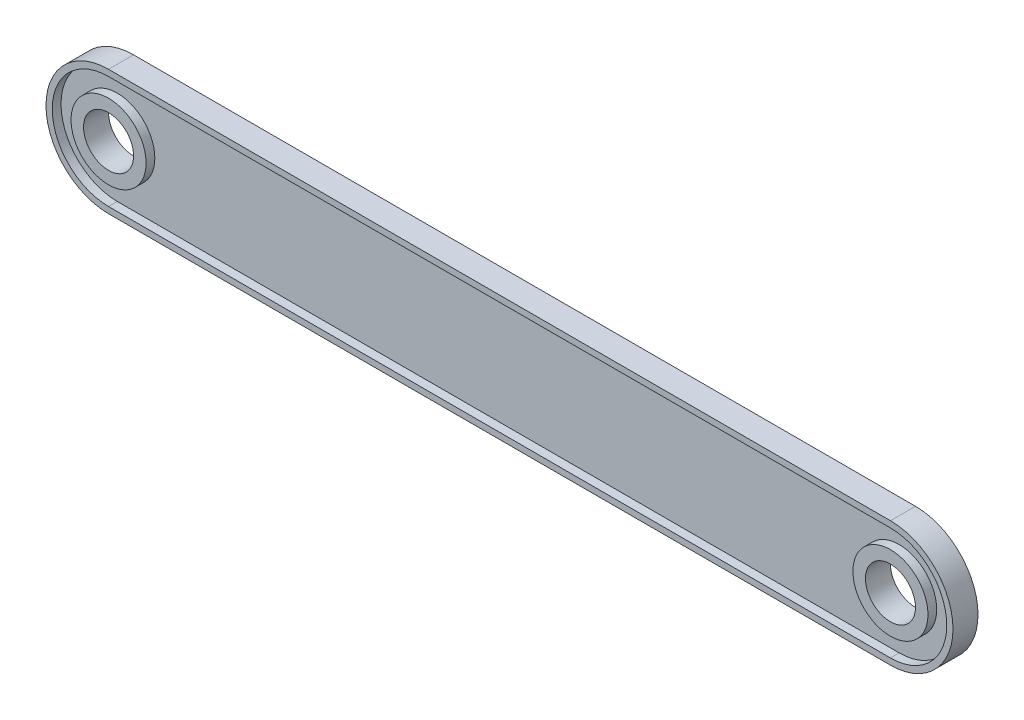
ISO-10303-21;
HEADER;
FILE_DESCRIPTION(('STEP AP214'),'2;1');
FILE_NAME('part.step','',(''),(''),'','','');
FILE_SCHEMA(('AUTOMOTIVE_DESIGN { 1 0 10303 214 1 1 1 1 }'));
ENDSEC;
DATA;
#1=APPLICATION_CONTEXT('core data for automotive mechanical design processes');
#2=APPLICATION_PROTOCOL_DEFINITION('international standard','automotive_design',2000,#1);
#3=PRODUCT_CONTEXT('',#1,'mechanical');
#4=PRODUCT('Part','Part','',(#3));
#5=PRODUCT_RELATED_PRODUCT_CATEGORY('part','',(#4));
#6=PRODUCT_DEFINITION_FORMATION('','',#4);
#7=PRODUCT_DEFINITION_CONTEXT('part definition',#1,'design');
#8=PRODUCT_DEFINITION('design','',#6,#7);
#9=PRODUCT_DEFINITION_SHAPE('','',#8);
#10=(LENGTH_UNIT() NAMED_UNIT(*) SI_UNIT(.MILLI.,.METRE.));
#11=(NAMED_UNIT(*) PLANE_ANGLE_UNIT() SI_UNIT($,.RADIAN.));
#12=(NAMED_UNIT(*) SI_UNIT($,.STERADIAN.) SOLID_ANGLE_UNIT());
#13=UNCERTAINTY_MEASURE_WITH_UNIT(LENGTH_MEASURE(1.E-05),#10,'distance_accuracy_value','');
#14=(GEOMETRIC_REPRESENTATION_CONTEXT(3) GLOBAL_UNCERTAINTY_ASSIGNED_CONTEXT((#13)) GLOBAL_UNIT_ASSIGNED_CONTEXT((#10,
#11,#12)) REPRESENTATION_CONTEXT('',''));
#15=CARTESIAN_POINT('',(0.,0.,0.));
#16=DIRECTION('',(0.,0.,1.));
#17=DIRECTION('',(1.,0.,0.));
#18=AXIS2_PLACEMENT_3D('',#15,#16,#17);
#19=CARTESIAN_POINT('',(0.,0.,-10.));
#20=DIRECTION('',(0.,0.,-1.));
#21=DIRECTION('',(-1.,0.,0.));
#22=AXIS2_PLACEMENT_3D('',#19,#20,#21);
#23=PLANE('',#22);
#24=CARTESIAN_POINT('',(0.,0.,-10.));
#25=DIRECTION('',(0.,0.,1.));
#26=DIRECTION('',(-1.,0.,0.));
#27=AXIS2_PLACEMENT_3D('',#24,#25,#26);
#28=CIRCLE('',#27,50.);
#29=CARTESIAN_POINT('',(0.,-50.,-10.));
#30=VERTEX_POINT('',#29);
#31=CARTESIAN_POINT('',(0.,50.,-10.));
#32=VERTEX_POINT('',#31);
#33=EDGE_CURVE('E225',#30,#32,#28,.T.);
#34=ORIENTED_EDGE('',*,*,#33,.F.);
#35=DIRECTION('',(1.,0.,0.));
#36=VECTOR('',#35,1.);
#37=CARTESIAN_POINT('',(0.,-50.,-10.));
#38=LINE('',#37,#36);
#39=CARTESIAN_POINT('',(-625.,-50.0000000000001,-10.));
#40=VERTEX_POINT('',#39);
#41=EDGE_CURVE('E232',#40,#30,#38,.T.);
#42=ORIENTED_EDGE('',*,*,#41,.F.);
#43=CARTESIAN_POINT('',(-625.,0.,-10.));
#44=DIRECTION('',(0.,0.,1.));
#45=DIRECTION('',(1.,0.,0.));
#46=AXIS2_PLACEMENT_3D('',#43,#44,#45);
#47=CIRCLE('',#46,50.);
#48=CARTESIAN_POINT('',(-625.,49.9999999999999,-10.));
#49=VERTEX_POINT('',#48);
#50=EDGE_CURVE('E243',#49,#40,#47,.T.);
#51=ORIENTED_EDGE('',*,*,#50,.F.);
#52=DIRECTION('',(-1.,0.,0.));
#53=VECTOR('',#52,1.);
#54=CARTESIAN_POINT('',(0.,50.,-10.));
#55=LINE('',#54,#53);
#56=EDGE_CURVE('E241',#32,#49,#55,.T.);
#57=ORIENTED_EDGE('',*,*,#56,.F.);
#58=EDGE_LOOP('',(#34,#42,#51,#57));
#59=FACE_BOUND('',#58,.T.);
#60=CARTESIAN_POINT('',(-625.,0.,-10.));
#61=DIRECTION('',(0.,0.,1.));
#62=DIRECTION('',(1.,0.,0.));
#63=AXIS2_PLACEMENT_3D('',#60,#61,#62);
#64=CIRCLE('',#63,45.);
#65=CARTESIAN_POINT('',(-625.,44.9999999999999,-10.));
#66=VERTEX_POINT('',#65);
#67=CARTESIAN_POINT('',(-625.,-45.0000000000001,-10.));
#68=VERTEX_POINT('',#67);
#69=EDGE_CURVE('E166',#66,#68,#64,.T.);
#70=ORIENTED_EDGE('',*,*,#69,.T.);
#71=DIRECTION('',(1.,0.,0.));
#72=VECTOR('',#71,1.);
#73=CARTESIAN_POINT('',(-625.,-45.0000000000001,-10.));
#74=LINE('',#73,#72);
#75=CARTESIAN_POINT('',(0.,-45.,-10.));
#76=VERTEX_POINT('',#75);
#77=EDGE_CURVE('E164',#68,#76,#74,.T.);
#78=ORIENTED_EDGE('',*,*,#77,.T.);
#79=CARTESIAN_POINT('',(0.,0.,-10.));
#80=DIRECTION('',(0.,0.,1.));
#81=DIRECTION('',(1.,0.,0.));
#82=AXIS2_PLACEMENT_3D('',#79,#80,#81);
#83=CIRCLE('',#82,45.);
#84=CARTESIAN_POINT('',(0.,45.,-10.));
#85=VERTEX_POINT('',#84);
#86=EDGE_CURVE('E132',#76,#85,#83,.T.);
#87=ORIENTED_EDGE('',*,*,#86,.T.);
#88=DIRECTION('',(-1.,0.,0.));
#89=VECTOR('',#88,1.);
#90=CARTESIAN_POINT('',(0.,45.,-10.));
#91=LINE('',#90,#89);
#92=EDGE_CURVE('E51',#85,#66,#91,.T.);
#93=ORIENTED_EDGE('',*,*,#92,.T.);
#94=EDGE_LOOP('',(#70,#78,#87,#93));
#95=FACE_BOUND('',#94,.T.);
#96=ADVANCED_FACE('F36',(#59,#95),#23,.T.);
#97=CARTESIAN_POINT('',(-625.,0.,-10.));
#98=DIRECTION('',(0.,0.,1.));
#99=DIRECTION('',(1.,0.,0.));
#100=AXIS2_PLACEMENT_3D('',#97,#98,#99);
#101=CIRCLE('',#100,29.9999999999999);
#102=CARTESIAN_POINT('',(-595.,0.,-10.));
#103=VERTEX_POINT('',#102);
#104=EDGE_CURVE('E160',#103,#103,#101,.T.);
#105=ORIENTED_EDGE('',*,*,#104,.F.);
#106=EDGE_LOOP('',(#105));
#107=FACE_BOUND('',#106,.T.);
#108=CARTESIAN_POINT('',(-625.,0.,-10.));
#109=DIRECTION('',(0.,0.,1.));
#110=DIRECTION('',(1.,0.,0.));
#111=AXIS2_PLACEMENT_3D('',#108,#109,#110);
#112=CIRCLE('',#111,20.);
#113=CARTESIAN_POINT('',(-605.,0.,-10.));
#114=VERTEX_POINT('',#113);
#115=EDGE_CURVE('E181',#114,#114,#112,.T.);
#116=ORIENTED_EDGE('',*,*,#115,.T.);
#117=EDGE_LOOP('',(#116));
#118=FACE_BOUND('',#117,.T.);
#119=ADVANCED_FACE('F280',(#107,#118),#23,.T.);
#120=CARTESIAN_POINT('',(0.,0.,10.));
#121=DIRECTION('',(0.,0.,-1.));
#122=DIRECTION('',(-1.,0.,0.));
#123=AXIS2_PLACEMENT_3D('',#120,#121,#122);
#124=PLANE('',#123);
#125=CARTESIAN_POINT('',(-625.,0.,10.));
#126=DIRECTION('',(0.,0.,1.));
#127=DIRECTION('',(1.,0.,0.));
#128=AXIS2_PLACEMENT_3D('',#125,#126,#127);
#129=CIRCLE('',#128,20.);
#130=CARTESIAN_POINT('',(-605.,0.,10.));
#131=VERTEX_POINT('',#130);
#132=EDGE_CURVE('E216',#131,#131,#129,.T.);
#133=ORIENTED_EDGE('',*,*,#132,.F.);
#134=EDGE_LOOP('',(#133));
#135=FACE_BOUND('',#134,.T.);
#136=CARTESIAN_POINT('',(-625.,0.,10.));
#137=DIRECTION('',(0.,0.,1.));
#138=DIRECTION('',(1.,0.,0.));
#139=AXIS2_PLACEMENT_3D('',#136,#137,#138);
#140=CIRCLE('',#139,29.9999999999999);
#141=CARTESIAN_POINT('',(-595.,0.,10.));
#142=VERTEX_POINT('',#141);
#143=EDGE_CURVE('E194',#142,#142,#140,.T.);
#144=ORIENTED_EDGE('',*,*,#143,.T.);
#145=EDGE_LOOP('',(#144));
#146=FACE_BOUND('',#145,.T.);
#147=ADVANCED_FACE('F285',(#135,#146),#124,.F.);
#148=CARTESIAN_POINT('',(0.,0.,10.));
#149=DIRECTION('',(0.,0.,1.));
#150=DIRECTION('',(1.,0.,0.));
#151=AXIS2_PLACEMENT_3D('',#148,#149,#150);
#152=CIRCLE('',#151,20.);
#153=CARTESIAN_POINT('',(20.,0.,10.));
#154=VERTEX_POINT('',#153);
#155=EDGE_CURVE('E222',#154,#154,#152,.T.);
#156=ORIENTED_EDGE('',*,*,#155,.F.);
#157=EDGE_LOOP('',(#156));
#158=FACE_BOUND('',#157,.T.);
#159=CARTESIAN_POINT('',(0.,0.,10.));
#160=DIRECTION('',(0.,0.,1.));
#161=DIRECTION('',(1.,0.,0.));
#162=AXIS2_PLACEMENT_3D('',#159,#160,#161);
#163=CIRCLE('',#162,30.);
#164=CARTESIAN_POINT('',(30.,0.,10.));
#165=VERTEX_POINT('',#164);
#166=EDGE_CURVE('E172',#165,#165,#163,.T.);
#167=ORIENTED_EDGE('',*,*,#166,.T.);
#168=EDGE_LOOP('',(#167));
#169=FACE_BOUND('',#168,.T.);
#170=ADVANCED_FACE('F294',(#158,#169),#124,.F.);
#171=CARTESIAN_POINT('',(-625.,0.,10.));
#172=DIRECTION('',(0.,0.,1.));
#173=DIRECTION('',(1.,0.,0.));
#174=AXIS2_PLACEMENT_3D('',#171,#172,#173);
#175=CIRCLE('',#174,45.);
#176=CARTESIAN_POINT('',(-625.,44.9999999999999,10.));
#177=VERTEX_POINT('',#176);
#178=CARTESIAN_POINT('',(-625.,-45.0000000000001,10.));
#179=VERTEX_POINT('',#178);
#180=EDGE_CURVE('E203',#177,#179,#175,.T.);
#181=ORIENTED_EDGE('',*,*,#180,.F.);
#182=DIRECTION('',(-1.,0.,0.));
#183=VECTOR('',#182,1.);
#184=CARTESIAN_POINT('',(0.,45.,10.));
#185=LINE('',#184,#183);
#186=CARTESIAN_POINT('',(0.,45.,10.));
#187=VERTEX_POINT('',#186);
#188=EDGE_CURVE('E200',#187,#177,#185,.T.);
#189=ORIENTED_EDGE('',*,*,#188,.F.);
#190=CARTESIAN_POINT('',(0.,0.,10.));
#191=DIRECTION('',(0.,0.,1.));
#192=DIRECTION('',(1.,0.,0.));
#193=AXIS2_PLACEMENT_3D('',#190,#191,#192);
#194=CIRCLE('',#193,45.);
#195=CARTESIAN_POINT('',(0.,-45.,10.));
#196=VERTEX_POINT('',#195);
#197=EDGE_CURVE('E197',#196,#187,#194,.T.);
#198=ORIENTED_EDGE('',*,*,#197,.F.);
#199=DIRECTION('',(1.,0.,0.));
#200=VECTOR('',#199,1.);
#201=CARTESIAN_POINT('',(-625.,-45.0000000000001,10.));
#202=LINE('',#201,#200);
#203=EDGE_CURVE('E59',#179,#196,#202,.T.);
#204=ORIENTED_EDGE('',*,*,#203,.F.);
#205=EDGE_LOOP('',(#181,#189,#198,#204));
#206=FACE_BOUND('',#205,.T.);
#207=CARTESIAN_POINT('',(0.,0.,10.));
#208=DIRECTION('',(0.,0.,1.));
#209=DIRECTION('',(-1.,0.,0.));
#210=AXIS2_PLACEMENT_3D('',#207,#208,#209);
#211=CIRCLE('',#210,50.);
#212=CARTESIAN_POINT('',(0.,-50.,10.));
#213=VERTEX_POINT('',#212);
#214=CARTESIAN_POINT('',(0.,50.,10.));
#215=VERTEX_POINT('',#214);
#216=EDGE_CURVE('E228',#213,#215,#211,.T.);
#217=ORIENTED_EDGE('',*,*,#216,.T.);
#218=DIRECTION('',(-1.,0.,0.));
#219=VECTOR('',#218,1.);
#220=CARTESIAN_POINT('',(0.,50.,10.));
#221=LINE('',#220,#219);
#222=CARTESIAN_POINT('',(-625.,49.9999999999999,10.));
#223=VERTEX_POINT('',#222);
#224=EDGE_CURVE('E231',#215,#223,#221,.T.);
#225=ORIENTED_EDGE('',*,*,#224,.T.);
#226=CARTESIAN_POINT('',(-625.,0.,10.));
#227=DIRECTION('',(0.,0.,1.));
#228=DIRECTION('',(1.,0.,0.));
#229=AXIS2_PLACEMENT_3D('',#226,#227,#228);
#230=CIRCLE('',#229,50.);
#231=CARTESIAN_POINT('',(-625.,-50.0000000000001,10.));
#232=VERTEX_POINT('',#231);
#233=EDGE_CURVE('E234',#223,#232,#230,.T.);
#234=ORIENTED_EDGE('',*,*,#233,.T.);
#235=DIRECTION('',(1.,0.,0.));
#236=VECTOR('',#235,1.);
#237=CARTESIAN_POINT('',(0.,-50.,10.));
#238=LINE('',#237,#236);
#239=EDGE_CURVE('E236',#232,#213,#238,.T.);
#240=ORIENTED_EDGE('',*,*,#239,.T.);
#241=EDGE_LOOP('',(#217,#225,#234,#240));
#242=FACE_BOUND('',#241,.T.);
#243=ADVANCED_FACE('F270',(#206,#242),#124,.F.);
#244=CARTESIAN_POINT('',(0.,0.,-10.));
#245=DIRECTION('',(0.,0.,1.));
#246=DIRECTION('',(1.,0.,0.));
#247=AXIS2_PLACEMENT_3D('',#244,#245,#246);
#248=CIRCLE('',#247,30.);
#249=CARTESIAN_POINT('',(30.,0.,-10.));
#250=VERTEX_POINT('',#249);
#251=EDGE_CURVE('E146',#250,#250,#248,.T.);
#252=ORIENTED_EDGE('',*,*,#251,.F.);
#253=EDGE_LOOP('',(#252));
#254=FACE_BOUND('',#253,.T.);
#255=CARTESIAN_POINT('',(0.,0.,-10.));
#256=DIRECTION('',(0.,0.,1.));
#257=DIRECTION('',(1.,0.,0.));
#258=AXIS2_PLACEMENT_3D('',#255,#256,#257);
#259=CIRCLE('',#258,20.);
#260=CARTESIAN_POINT('',(20.,0.,-10.));
#261=VERTEX_POINT('',#260);
#262=EDGE_CURVE('E219',#261,#261,#259,.T.);
#263=ORIENTED_EDGE('',*,*,#262,.T.);
#264=EDGE_LOOP('',(#263));
#265=FACE_BOUND('',#264,.T.);
#266=ADVANCED_FACE('F278',(#254,#265),#23,.T.);
#267=CARTESIAN_POINT('',(0.,0.,10.));
#268=DIRECTION('',(0.,0.,-1.));
#269=DIRECTION('',(-1.,0.,0.));
#270=AXIS2_PLACEMENT_3D('',#267,#268,#269);
#271=CYLINDRICAL_SURFACE('',#270,50.);
#272=ORIENTED_EDGE('',*,*,#33,.T.);
#273=DIRECTION('',(0.,0.,-1.));
#274=VECTOR('',#273,1.);
#275=CARTESIAN_POINT('',(0.,50.,10.));
#276=LINE('',#275,#274);
#277=EDGE_CURVE('E12',#215,#32,#276,.T.);
#278=ORIENTED_EDGE('',*,*,#277,.F.);
#279=ORIENTED_EDGE('',*,*,#216,.F.);
#280=DIRECTION('',(0.,0.,-1.));
#281=VECTOR('',#280,1.);
#282=CARTESIAN_POINT('',(0.,-50.,10.));
#283=LINE('',#282,#281);
#284=EDGE_CURVE('E238',#213,#30,#283,.T.);
#285=ORIENTED_EDGE('',*,*,#284,.T.);
#286=EDGE_LOOP('',(#272,#278,#279,#285));
#287=FACE_BOUND('',#286,.T.);
#288=ADVANCED_FACE('F38',(#287),#271,.T.);
#289=CARTESIAN_POINT('',(0.,50.,10.));
#290=DIRECTION('',(0.,-1.,0.));
#291=DIRECTION('',(1.,0.,0.));
#292=AXIS2_PLACEMENT_3D('',#289,#290,#291);
#293=PLANE('',#292);
#294=ORIENTED_EDGE('',*,*,#56,.T.);
#295=DIRECTION('',(0.,0.,-1.));
#296=VECTOR('',#295,1.);
#297=CARTESIAN_POINT('',(-625.,49.9999999999999,10.));
#298=LINE('',#297,#296);
#299=EDGE_CURVE('E44',#223,#49,#298,.T.);
#300=ORIENTED_EDGE('',*,*,#299,.F.);
#301=ORIENTED_EDGE('',*,*,#224,.F.);
#302=ORIENTED_EDGE('',*,*,#277,.T.);
#303=EDGE_LOOP('',(#294,#300,#301,#302));
#304=FACE_BOUND('',#303,.T.);
#305=ADVANCED_FACE('F271',(#304),#293,.F.);
#306=CARTESIAN_POINT('',(-625.,0.,10.));
#307=DIRECTION('',(0.,0.,-1.));
#308=DIRECTION('',(-1.,0.,0.));
#309=AXIS2_PLACEMENT_3D('',#306,#307,#308);
#310=CYLINDRICAL_SURFACE('',#309,50.);
#311=ORIENTED_EDGE('',*,*,#50,.T.);
#312=DIRECTION('',(0.,0.,-1.));
#313=VECTOR('',#312,1.);
#314=CARTESIAN_POINT('',(-625.,-50.0000000000001,10.));
#315=LINE('',#314,#313);
#316=EDGE_CURVE('E248',#232,#40,#315,.T.);
#317=ORIENTED_EDGE('',*,*,#316,.F.);
#318=ORIENTED_EDGE('',*,*,#233,.F.);
#319=ORIENTED_EDGE('',*,*,#299,.T.);
#320=EDGE_LOOP('',(#311,#317,#318,#319));
#321=FACE_BOUND('',#320,.T.);
#322=ADVANCED_FACE('F255',(#321),#310,.T.);
#323=CARTESIAN_POINT('',(0.,-50.,10.));
#324=DIRECTION('',(0.,1.,0.));
#325=DIRECTION('',(-1.,0.,0.));
#326=AXIS2_PLACEMENT_3D('',#323,#324,#325);
#327=PLANE('',#326);
#328=ORIENTED_EDGE('',*,*,#41,.T.);
#329=ORIENTED_EDGE('',*,*,#284,.F.);
#330=ORIENTED_EDGE('',*,*,#239,.F.);
#331=ORIENTED_EDGE('',*,*,#316,.T.);
#332=EDGE_LOOP('',(#328,#329,#330,#331));
#333=FACE_BOUND('',#332,.T.);
#334=ADVANCED_FACE('F264',(#333),#327,.F.);
#335=CARTESIAN_POINT('',(0.,0.,10.));
#336=DIRECTION('',(0.,0.,-1.));
#337=DIRECTION('',(-1.,0.,0.));
#338=AXIS2_PLACEMENT_3D('',#335,#336,#337);
#339=CYLINDRICAL_SURFACE('',#338,20.);
#340=ORIENTED_EDGE('',*,*,#155,.T.);
#341=EDGE_LOOP('',(#340));
#342=FACE_BOUND('',#341,.T.);
#343=ORIENTED_EDGE('',*,*,#262,.F.);
#344=EDGE_LOOP('',(#343));
#345=FACE_BOUND('',#344,.T.);
#346=ADVANCED_FACE('F300',(#342,#345),#339,.F.);
#347=CARTESIAN_POINT('',(-625.,0.,10.));
#348=DIRECTION('',(0.,0.,-1.));
#349=DIRECTION('',(-1.,0.,0.));
#350=AXIS2_PLACEMENT_3D('',#347,#348,#349);
#351=CYLINDRICAL_SURFACE('',#350,20.);
#352=ORIENTED_EDGE('',*,*,#132,.T.);
#353=EDGE_LOOP('',(#352));
#354=FACE_BOUND('',#353,.T.);
#355=ORIENTED_EDGE('',*,*,#115,.F.);
#356=EDGE_LOOP('',(#355));
#357=FACE_BOUND('',#356,.T.);
#358=ADVANCED_FACE('F302',(#354,#357),#351,.F.);
#359=CARTESIAN_POINT('',(0.,45.,-720.642074819393));
#360=DIRECTION('',(0.,1.,0.));
#361=DIRECTION('',(-1.,0.,0.));
#362=AXIS2_PLACEMENT_3D('',#359,#360,#361);
#363=PLANE('',#362);
#364=DIRECTION('',(1.,0.,0.));
#365=VECTOR('',#364,1.);
#366=CARTESIAN_POINT('',(0.,45.,3.));
#367=LINE('',#366,#365);
#368=CARTESIAN_POINT('',(-625.,44.9999999999999,3.));
#369=VERTEX_POINT('',#368);
#370=CARTESIAN_POINT('',(0.,45.,3.));
#371=VERTEX_POINT('',#370);
#372=EDGE_CURVE('E183',#369,#371,#367,.T.);
#373=ORIENTED_EDGE('',*,*,#372,.T.);
#374=DIRECTION('',(0.,0.,1.));
#375=VECTOR('',#374,1.);
#376=CARTESIAN_POINT('',(0.,45.,-720.642074819393));
#377=LINE('',#376,#375);
#378=EDGE_CURVE('E207',#371,#187,#377,.T.);
#379=ORIENTED_EDGE('',*,*,#378,.T.);
#380=ORIENTED_EDGE('',*,*,#188,.T.);
#381=DIRECTION('',(0.,0.,1.));
#382=VECTOR('',#381,1.);
#383=CARTESIAN_POINT('',(-625.,44.9999999999999,-720.642074819393));
#384=LINE('',#383,#382);
#385=EDGE_CURVE('E211',#369,#177,#384,.T.);
#386=ORIENTED_EDGE('',*,*,#385,.F.);
#387=EDGE_LOOP('',(#373,#379,#380,#386));
#388=FACE_BOUND('',#387,.T.);
#389=ADVANCED_FACE('F309',(#388),#363,.F.);
#390=CARTESIAN_POINT('',(-625.,0.,-720.642074819393));
#391=DIRECTION('',(0.,0.,1.));
#392=DIRECTION('',(1.,0.,0.));
#393=AXIS2_PLACEMENT_3D('',#390,#391,#392);
#394=CYLINDRICAL_SURFACE('',#393,45.);
#395=CARTESIAN_POINT('',(-625.,0.,3.));
#396=DIRECTION('',(0.,0.,1.));
#397=DIRECTION('',(1.,0.,0.));
#398=AXIS2_PLACEMENT_3D('',#395,#396,#397);
#399=CIRCLE('',#398,45.);
#400=CARTESIAN_POINT('',(-625.,-45.0000000000001,3.));
#401=VERTEX_POINT('',#400);
#402=EDGE_CURVE('E186',#401,#369,#399,.F.);
#403=ORIENTED_EDGE('',*,*,#402,.T.);
#404=ORIENTED_EDGE('',*,*,#385,.T.);
#405=ORIENTED_EDGE('',*,*,#180,.T.);
#406=DIRECTION('',(0.,0.,1.));
#407=VECTOR('',#406,1.);
#408=CARTESIAN_POINT('',(-625.,-45.0000000000001,-720.642074819393));
#409=LINE('',#408,#407);
#410=EDGE_CURVE('E209',#401,#179,#409,.T.);
#411=ORIENTED_EDGE('',*,*,#410,.F.);
#412=EDGE_LOOP('',(#403,#404,#405,#411));
#413=FACE_BOUND('',#412,.T.);
#414=ADVANCED_FACE('F321',(#413),#394,.F.);
#415=CARTESIAN_POINT('',(-625.,-45.0000000000001,-720.642074819393));
#416=DIRECTION('',(0.,-1.,0.));
#417=DIRECTION('',(1.,0.,0.));
#418=AXIS2_PLACEMENT_3D('',#415,#416,#417);
#419=PLANE('',#418);
#420=DIRECTION('',(-1.,0.,0.));
#421=VECTOR('',#420,1.);
#422=CARTESIAN_POINT('',(-625.,-45.0000000000001,3.));
#423=LINE('',#422,#421);
#424=CARTESIAN_POINT('',(0.,-45.,3.));
#425=VERTEX_POINT('',#424);
#426=EDGE_CURVE('E188',#425,#401,#423,.T.);
#427=ORIENTED_EDGE('',*,*,#426,.T.);
#428=ORIENTED_EDGE('',*,*,#410,.T.);
#429=ORIENTED_EDGE('',*,*,#203,.T.);
#430=DIRECTION('',(0.,0.,1.));
#431=VECTOR('',#430,1.);
#432=CARTESIAN_POINT('',(0.,-45.,-720.642074819393));
#433=LINE('',#432,#431);
#434=EDGE_CURVE('E189',#425,#196,#433,.T.);
#435=ORIENTED_EDGE('',*,*,#434,.F.);
#436=EDGE_LOOP('',(#427,#428,#429,#435));
#437=FACE_BOUND('',#436,.T.);
#438=ADVANCED_FACE('F317',(#437),#419,.F.);
#439=CARTESIAN_POINT('',(0.,0.,-720.642074819393));
#440=DIRECTION('',(0.,0.,1.));
#441=DIRECTION('',(1.,0.,0.));
#442=AXIS2_PLACEMENT_3D('',#439,#440,#441);
#443=CYLINDRICAL_SURFACE('',#442,45.);
#444=CARTESIAN_POINT('',(0.,0.,3.));
#445=DIRECTION('',(0.,0.,1.));
#446=DIRECTION('',(1.,0.,0.));
#447=AXIS2_PLACEMENT_3D('',#444,#445,#446);
#448=CIRCLE('',#447,45.);
#449=EDGE_CURVE('E185',#371,#425,#448,.F.);
#450=ORIENTED_EDGE('',*,*,#449,.T.);
#451=ORIENTED_EDGE('',*,*,#434,.T.);
#452=ORIENTED_EDGE('',*,*,#197,.T.);
#453=ORIENTED_EDGE('',*,*,#378,.F.);
#454=EDGE_LOOP('',(#450,#451,#452,#453));
#455=FACE_BOUND('',#454,.T.);
#456=ADVANCED_FACE('F313',(#455),#443,.F.);
#457=CARTESIAN_POINT('',(-625.,0.,-720.642074819393));
#458=DIRECTION('',(0.,0.,1.));
#459=DIRECTION('',(1.,0.,0.));
#460=AXIS2_PLACEMENT_3D('',#457,#458,#459);
#461=CYLINDRICAL_SURFACE('',#460,29.9999999999999);
#462=CARTESIAN_POINT('',(-625.,0.,3.));
#463=DIRECTION('',(0.,0.,1.));
#464=DIRECTION('',(1.,0.,0.));
#465=AXIS2_PLACEMENT_3D('',#462,#463,#464);
#466=CIRCLE('',#465,29.9999999999999);
#467=CARTESIAN_POINT('',(-595.,0.,3.));
#468=VERTEX_POINT('',#467);
#469=EDGE_CURVE('E178',#468,#468,#466,.F.);
#470=ORIENTED_EDGE('',*,*,#469,.F.);
#471=EDGE_LOOP('',(#470));
#472=FACE_BOUND('',#471,.T.);
#473=ORIENTED_EDGE('',*,*,#143,.F.);
#474=EDGE_LOOP('',(#473));
#475=FACE_BOUND('',#474,.T.);
#476=ADVANCED_FACE('F316',(#472,#475),#461,.T.);
#477=CARTESIAN_POINT('',(0.,0.,-720.642074819393));
#478=DIRECTION('',(0.,0.,1.));
#479=DIRECTION('',(1.,0.,0.));
#480=AXIS2_PLACEMENT_3D('',#477,#478,#479);
#481=CYLINDRICAL_SURFACE('',#480,30.);
#482=CARTESIAN_POINT('',(0.,0.,3.));
#483=DIRECTION('',(0.,0.,1.));
#484=DIRECTION('',(1.,0.,0.));
#485=AXIS2_PLACEMENT_3D('',#482,#483,#484);
#486=CIRCLE('',#485,30.);
#487=CARTESIAN_POINT('',(30.,0.,3.));
#488=VERTEX_POINT('',#487);
#489=EDGE_CURVE('E182',#488,#488,#486,.F.);
#490=ORIENTED_EDGE('',*,*,#489,.F.);
#491=EDGE_LOOP('',(#490));
#492=FACE_BOUND('',#491,.T.);
#493=ORIENTED_EDGE('',*,*,#166,.F.);
#494=EDGE_LOOP('',(#493));
#495=FACE_BOUND('',#494,.T.);
#496=ADVANCED_FACE('F330',(#492,#495),#481,.T.);
#497=CARTESIAN_POINT('',(0.,0.,3.));
#498=DIRECTION('',(0.,0.,1.));
#499=DIRECTION('',(1.,0.,0.));
#500=AXIS2_PLACEMENT_3D('',#497,#498,#499);
#501=PLANE('',#500);
#502=ORIENTED_EDGE('',*,*,#449,.F.);
#503=ORIENTED_EDGE('',*,*,#372,.F.);
#504=ORIENTED_EDGE('',*,*,#402,.F.);
#505=ORIENTED_EDGE('',*,*,#426,.F.);
#506=EDGE_LOOP('',(#502,#503,#504,#505));
#507=FACE_BOUND('',#506,.T.);
#508=ORIENTED_EDGE('',*,*,#489,.T.);
#509=EDGE_LOOP('',(#508));
#510=FACE_BOUND('',#509,.T.);
#511=ORIENTED_EDGE('',*,*,#469,.T.);
#512=EDGE_LOOP('',(#511));
#513=FACE_BOUND('',#512,.T.);
#514=ADVANCED_FACE('F334',(#507,#510,#513),#501,.T.);
#515=CARTESIAN_POINT('',(-625.,-45.0000000000001,720.642074819393));
#516=DIRECTION('',(0.,1.,0.));
#517=DIRECTION('',(-1.,0.,0.));
#518=AXIS2_PLACEMENT_3D('',#515,#516,#517);
#519=PLANE('',#518);
#520=DIRECTION('',(1.,0.,0.));
#521=VECTOR('',#520,1.);
#522=CARTESIAN_POINT('',(-625.,-45.0000000000001,-3.));
#523=LINE('',#522,#521);
#524=CARTESIAN_POINT('',(-625.,-45.0000000000001,-3.));
#525=VERTEX_POINT('',#524);
#526=CARTESIAN_POINT('',(0.,-45.,-3.));
#527=VERTEX_POINT('',#526);
#528=EDGE_CURVE('E142',#525,#527,#523,.T.);
#529=ORIENTED_EDGE('',*,*,#528,.T.);
#530=DIRECTION('',(0.,0.,-1.));
#531=VECTOR('',#530,1.);
#532=CARTESIAN_POINT('',(0.,-45.,720.642074819393));
#533=LINE('',#532,#531);
#534=EDGE_CURVE('E127',#527,#76,#533,.T.);
#535=ORIENTED_EDGE('',*,*,#534,.T.);
#536=ORIENTED_EDGE('',*,*,#77,.F.);
#537=DIRECTION('',(0.,0.,-1.));
#538=VECTOR('',#537,1.);
#539=CARTESIAN_POINT('',(-625.,-45.0000000000001,720.642074819393));
#540=LINE('',#539,#538);
#541=EDGE_CURVE('E137',#525,#68,#540,.T.);
#542=ORIENTED_EDGE('',*,*,#541,.F.);
#543=EDGE_LOOP('',(#529,#535,#536,#542));
#544=FACE_BOUND('',#543,.T.);
#545=ADVANCED_FACE('F148',(#544),#519,.T.);
#546=CARTESIAN_POINT('',(-625.,0.,720.642074819393));
#547=DIRECTION('',(0.,0.,-1.));
#548=DIRECTION('',(-1.,0.,0.));
#549=AXIS2_PLACEMENT_3D('',#546,#547,#548);
#550=CYLINDRICAL_SURFACE('',#549,45.);
#551=CARTESIAN_POINT('',(-625.,0.,-3.));
#552=DIRECTION('',(0.,0.,1.));
#553=DIRECTION('',(1.,0.,0.));
#554=AXIS2_PLACEMENT_3D('',#551,#552,#553);
#555=CIRCLE('',#554,45.);
#556=CARTESIAN_POINT('',(-625.,44.9999999999999,-3.));
#557=VERTEX_POINT('',#556);
#558=EDGE_CURVE('E149',#557,#525,#555,.T.);
#559=ORIENTED_EDGE('',*,*,#558,.T.);
#560=ORIENTED_EDGE('',*,*,#541,.T.);
#561=ORIENTED_EDGE('',*,*,#69,.F.);
#562=DIRECTION('',(0.,0.,-1.));
#563=VECTOR('',#562,1.);
#564=CARTESIAN_POINT('',(-625.,44.9999999999999,720.642074819393));
#565=LINE('',#564,#563);
#566=EDGE_CURVE('E173',#557,#66,#565,.T.);
#567=ORIENTED_EDGE('',*,*,#566,.F.);
#568=EDGE_LOOP('',(#559,#560,#561,#567));
#569=FACE_BOUND('',#568,.T.);
#570=ADVANCED_FACE('F345',(#569),#550,.F.);
#571=CARTESIAN_POINT('',(0.,45.,720.642074819393));
#572=DIRECTION('',(0.,-1.,0.));
#573=DIRECTION('',(1.,0.,0.));
#574=AXIS2_PLACEMENT_3D('',#571,#572,#573);
#575=PLANE('',#574);
#576=DIRECTION('',(-1.,0.,0.));
#577=VECTOR('',#576,1.);
#578=CARTESIAN_POINT('',(0.,45.,-3.));
#579=LINE('',#578,#577);
#580=CARTESIAN_POINT('',(0.,45.,-3.));
#581=VERTEX_POINT('',#580);
#582=EDGE_CURVE('E145',#581,#557,#579,.T.);
#583=ORIENTED_EDGE('',*,*,#582,.T.);
#584=ORIENTED_EDGE('',*,*,#566,.T.);
#585=ORIENTED_EDGE('',*,*,#92,.F.);
#586=DIRECTION('',(0.,0.,-1.));
#587=VECTOR('',#586,1.);
#588=CARTESIAN_POINT('',(0.,45.,720.642074819393));
#589=LINE('',#588,#587);
#590=EDGE_CURVE('E170',#581,#85,#589,.T.);
#591=ORIENTED_EDGE('',*,*,#590,.F.);
#592=EDGE_LOOP('',(#583,#584,#585,#591));
#593=FACE_BOUND('',#592,.T.);
#594=ADVANCED_FACE('F342',(#593),#575,.T.);
#595=CARTESIAN_POINT('',(0.,0.,720.642074819393));
#596=DIRECTION('',(0.,0.,-1.));
#597=DIRECTION('',(-1.,0.,0.));
#598=AXIS2_PLACEMENT_3D('',#595,#596,#597);
#599=CYLINDRICAL_SURFACE('',#598,45.);
#600=CARTESIAN_POINT('',(0.,0.,-3.));
#601=DIRECTION('',(0.,0.,1.));
#602=DIRECTION('',(1.,0.,0.));
#603=AXIS2_PLACEMENT_3D('',#600,#601,#602);
#604=CIRCLE('',#603,45.);
#605=EDGE_CURVE('E130',#527,#581,#604,.T.);
#606=ORIENTED_EDGE('',*,*,#605,.T.);
#607=ORIENTED_EDGE('',*,*,#590,.T.);
#608=ORIENTED_EDGE('',*,*,#86,.F.);
#609=ORIENTED_EDGE('',*,*,#534,.F.);
#610=EDGE_LOOP('',(#606,#607,#608,#609));
#611=FACE_BOUND('',#610,.T.);
#612=ADVANCED_FACE('F129',(#611),#599,.F.);
#613=CARTESIAN_POINT('',(-625.,0.,720.642074819393));
#614=DIRECTION('',(0.,0.,-1.));
#615=DIRECTION('',(-1.,0.,0.));
#616=AXIS2_PLACEMENT_3D('',#613,#614,#615);
#617=CYLINDRICAL_SURFACE('',#616,29.9999999999999);
#618=ORIENTED_EDGE('',*,*,#104,.T.);
#619=EDGE_LOOP('',(#618));
#620=FACE_BOUND('',#619,.T.);
#621=CARTESIAN_POINT('',(-625.,0.,-3.));
#622=DIRECTION('',(0.,0.,1.));
#623=DIRECTION('',(1.,0.,0.));
#624=AXIS2_PLACEMENT_3D('',#621,#622,#623);
#625=CIRCLE('',#624,29.9999999999999);
#626=CARTESIAN_POINT('',(-595.,0.,-3.));
#627=VERTEX_POINT('',#626);
#628=EDGE_CURVE('E150',#627,#627,#625,.T.);
#629=ORIENTED_EDGE('',*,*,#628,.F.);
#630=EDGE_LOOP('',(#629));
#631=FACE_BOUND('',#630,.T.);
#632=ADVANCED_FACE('F341',(#620,#631),#617,.T.);
#633=CARTESIAN_POINT('',(0.,0.,720.642074819393));
#634=DIRECTION('',(0.,0.,-1.));
#635=DIRECTION('',(-1.,0.,0.));
#636=AXIS2_PLACEMENT_3D('',#633,#634,#635);
#637=CYLINDRICAL_SURFACE('',#636,30.);
#638=ORIENTED_EDGE('',*,*,#251,.T.);
#639=EDGE_LOOP('',(#638));
#640=FACE_BOUND('',#639,.T.);
#641=CARTESIAN_POINT('',(0.,0.,-3.));
#642=DIRECTION('',(0.,0.,1.));
#643=DIRECTION('',(1.,0.,0.));
#644=AXIS2_PLACEMENT_3D('',#641,#642,#643);
#645=CIRCLE('',#644,30.);
#646=CARTESIAN_POINT('',(30.,0.,-3.));
#647=VERTEX_POINT('',#646);
#648=EDGE_CURVE('E154',#647,#647,#645,.T.);
#649=ORIENTED_EDGE('',*,*,#648,.F.);
#650=EDGE_LOOP('',(#649));
#651=FACE_BOUND('',#650,.T.);
#652=ADVANCED_FACE('F353',(#640,#651),#637,.T.);
#653=CARTESIAN_POINT('',(0.,0.,-3.));
#654=DIRECTION('',(0.,0.,1.));
#655=DIRECTION('',(1.,0.,0.));
#656=AXIS2_PLACEMENT_3D('',#653,#654,#655);
#657=PLANE('',#656);
#658=ORIENTED_EDGE('',*,*,#648,.T.);
#659=EDGE_LOOP('',(#658));
#660=FACE_BOUND('',#659,.T.);
#661=ORIENTED_EDGE('',*,*,#628,.T.);
#662=EDGE_LOOP('',(#661));
#663=FACE_BOUND('',#662,.T.);
#664=ORIENTED_EDGE('',*,*,#528,.F.);
#665=ORIENTED_EDGE('',*,*,#558,.F.);
#666=ORIENTED_EDGE('',*,*,#582,.F.);
#667=ORIENTED_EDGE('',*,*,#605,.F.);
#668=EDGE_LOOP('',(#664,#665,#666,#667));
#669=FACE_BOUND('',#668,.T.);
#670=ADVANCED_FACE('F141',(#660,#663,#669),#657,.F.);
#671=CLOSED_SHELL('',(#96,#119,#147,#170,#243,#266,#288,#305,#322,#334,#346,#358,#389,#414,#438,
#456,#476,#496,#514,#545,#570,#594,#612,#632,#652,#670));
#672=MANIFOLD_SOLID_BREP('B2',#671);
#673=ADVANCED_BREP_SHAPE_REPRESENTATION('',(#18,#672),#14);
#674=SHAPE_DEFINITION_REPRESENTATION(#9,#673);
ENDSEC;
END-ISO-10303-21;
